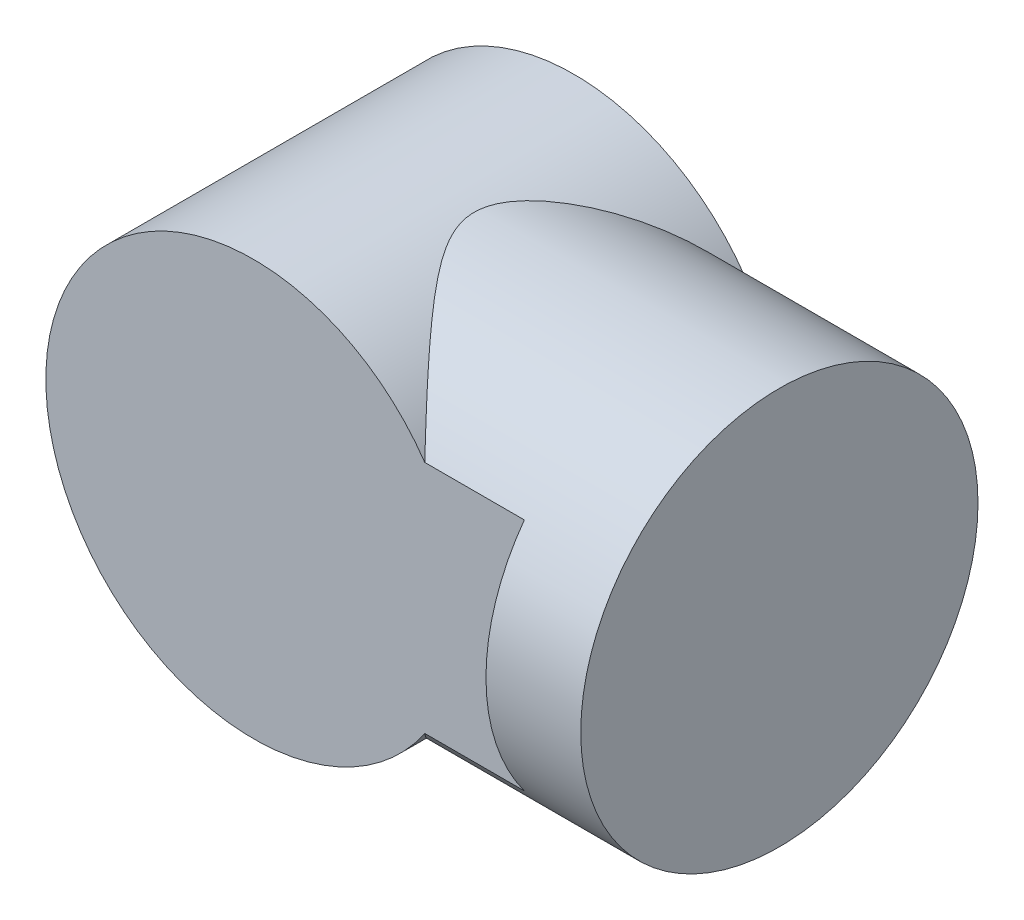
ISO-10303-21;
HEADER;
FILE_DESCRIPTION(('STEP AP214'),'2;1');
FILE_NAME('part.step','',(''),(''),'','','');
FILE_SCHEMA(('AUTOMOTIVE_DESIGN { 1 0 10303 214 1 1 1 1 }'));
ENDSEC;
DATA;
#1=APPLICATION_CONTEXT('core data for automotive mechanical design processes');
#2=APPLICATION_PROTOCOL_DEFINITION('international standard','automotive_design',2000,#1);
#3=PRODUCT_CONTEXT('',#1,'mechanical');
#4=PRODUCT('Part','Part','',(#3));
#5=PRODUCT_RELATED_PRODUCT_CATEGORY('part','',(#4));
#6=PRODUCT_DEFINITION_FORMATION('','',#4);
#7=PRODUCT_DEFINITION_CONTEXT('part definition',#1,'design');
#8=PRODUCT_DEFINITION('design','',#6,#7);
#9=PRODUCT_DEFINITION_SHAPE('','',#8);
#10=(LENGTH_UNIT() NAMED_UNIT(*) SI_UNIT(.MILLI.,.METRE.));
#11=(NAMED_UNIT(*) PLANE_ANGLE_UNIT() SI_UNIT($,.RADIAN.));
#12=(NAMED_UNIT(*) SI_UNIT($,.STERADIAN.) SOLID_ANGLE_UNIT());
#13=UNCERTAINTY_MEASURE_WITH_UNIT(LENGTH_MEASURE(1.E-05),#10,'distance_accuracy_value','');
#14=(GEOMETRIC_REPRESENTATION_CONTEXT(3) GLOBAL_UNCERTAINTY_ASSIGNED_CONTEXT((#13)) GLOBAL_UNIT_ASSIGNED_CONTEXT((#10,
#11,#12)) REPRESENTATION_CONTEXT('',''));
#15=CARTESIAN_POINT('',(0.,0.,0.));
#16=DIRECTION('',(0.,0.,1.));
#17=DIRECTION('',(1.,0.,0.));
#18=AXIS2_PLACEMENT_3D('',#15,#16,#17);
#19=CARTESIAN_POINT('',(-46.001,0.,0.));
#20=DIRECTION('',(1.,0.,0.));
#21=DIRECTION('',(0.,0.,-1.));
#22=AXIS2_PLACEMENT_3D('',#19,#20,#21);
#23=CYLINDRICAL_SURFACE('',#22,44.);
#24=CARTESIAN_POINT('',(81.,0.,0.));
#25=DIRECTION('',(1.,0.,0.));
#26=DIRECTION('',(0.,0.,-1.));
#27=AXIS2_PLACEMENT_3D('',#24,#25,#26);
#28=CIRCLE('',#27,44.);
#29=CARTESIAN_POINT('',(81.,0.,-44.));
#30=VERTEX_POINT('',#29);
#31=EDGE_CURVE('E99',#30,#30,#28,.T.);
#32=ORIENTED_EDGE('',*,*,#31,.F.);
#33=EDGE_LOOP('',(#32));
#34=FACE_BOUND('',#33,.T.);
#35=CARTESIAN_POINT('',(60.,0.,0.));
#36=DIRECTION('',(1.,0.,0.));
#37=DIRECTION('',(0.,0.,-1.));
#38=AXIS2_PLACEMENT_3D('',#35,#36,#37);
#39=CIRCLE('',#38,44.);
#40=CARTESIAN_POINT('',(60.,25.9951918631119,-35.5));
#41=VERTEX_POINT('',#40);
#42=CARTESIAN_POINT('',(60.,-25.9951918631119,-35.5));
#43=VERTEX_POINT('',#42);
#44=EDGE_CURVE('E11',#41,#43,#39,.F.);
#45=ORIENTED_EDGE('',*,*,#44,.F.);
#46=DIRECTION('',(1.,0.,0.));
#47=VECTOR('',#46,1.);
#48=CARTESIAN_POINT('',(-46.001,25.9951918631119,-35.5));
#49=LINE('',#48,#47);
#50=CARTESIAN_POINT('',(37.9506258182919,25.9951918631119,-35.5));
#51=VERTEX_POINT('',#50);
#52=EDGE_CURVE('E76',#41,#51,#49,.F.);
#53=ORIENTED_EDGE('',*,*,#52,.T.);
#54=CARTESIAN_POINT('',(46.,0.,-44.));
#55=CARTESIAN_POINT('',(45.9999991057955,0.498474220676919,-43.9999990933562));
#56=CARTESIAN_POINT('',(45.9918911782464,0.996963692521347,-43.9915228687049));
#57=CARTESIAN_POINT('',(45.9595141891246,1.99286088749782,-43.9576724035265));
#58=CARTESIAN_POINT('',(45.9352430356015,2.49026846224209,-43.9322959756644));
#59=CARTESIAN_POINT('',(45.838310778703,3.97977942802874,-43.8309384583672));
#60=CARTESIAN_POINT('',(45.741530996917,4.96882241231484,-43.7297292507759));
#61=CARTESIAN_POINT('',(45.4854837981313,6.9320927267576,-43.4618312832369));
#62=CARTESIAN_POINT('',(45.3260623756231,7.90627734827558,-43.2949811427232));
#63=CARTESIAN_POINT('',(44.9480946099699,9.83002949923253,-42.8991220167134));
#64=CARTESIAN_POINT('',(44.7295571347305,10.7796006974994,-42.6701223541519));
#65=CARTESIAN_POINT('',(44.2393242800979,12.6412913734987,-42.1559459302167));
#66=CARTESIAN_POINT('',(43.9680278102338,13.5536333156418,-41.8711906316068));
#67=CARTESIAN_POINT('',(43.3758705826448,15.3434844219592,-41.2489428287368));
#68=CARTESIAN_POINT('',(43.055009104289,16.2209930794556,-40.911449557713));
#69=CARTESIAN_POINT('',(42.3686965740621,17.9373222800729,-40.1885473092639));
#70=CARTESIAN_POINT('',(42.003266305577,18.776160606432,-39.8031606639729));
#71=CARTESIAN_POINT('',(41.2323653189115,20.4135016545342,-38.9887829085305));
#72=CARTESIAN_POINT('',(40.8268853718402,21.211995014965,-38.5597817473504));
#73=CARTESIAN_POINT('',(40.1057489538878,22.5370289440701,-37.7952655368586));
#74=CARTESIAN_POINT('',(39.7989794234237,23.0741759955678,-37.4696105805746));
#75=CARTESIAN_POINT('',(39.1695108539914,24.1272810085256,-36.8003191130999));
#76=CARTESIAN_POINT('',(38.846815163032,24.6432433820162,-36.4566863803062));
#77=CARTESIAN_POINT('',(37.8566653790016,26.1597136861254,-35.4003883118248));
#78=CARTESIAN_POINT('',(37.1672734069329,27.1285775238644,-34.6624552465624));
#79=CARTESIAN_POINT('',(35.7393897631714,28.9839743626513,-33.1267882618577));
#80=CARTESIAN_POINT('',(35.0007706053117,29.8702781180943,-32.32889833019));
#81=CARTESIAN_POINT('',(33.4858126070623,31.5592581006085,-30.6823076572974));
#82=CARTESIAN_POINT('',(32.7094764102405,32.3619401763162,-29.8336104761609));
#83=CARTESIAN_POINT('',(31.3954179461172,33.6282094995737,-28.3853985995029));
#84=CARTESIAN_POINT('',(30.8656572430636,34.1147651208718,-27.7985295595618));
#85=CARTESIAN_POINT('',(29.7961359088939,35.0527623149084,-26.6060028658219));
#86=CARTESIAN_POINT('',(29.2563745852962,35.5042014447091,-26.0003439089636));
#87=CARTESIAN_POINT('',(28.1692123228364,36.372790482232,-24.770691454131));
#88=CARTESIAN_POINT('',(27.621806628977,36.7899178242605,-24.1466862508457));
#89=CARTESIAN_POINT('',(26.5225407688364,37.5901174330788,-22.8810752855392));
#90=CARTESIAN_POINT('',(25.9706807668905,37.973190950028,-22.2394701707658));
#91=CARTESIAN_POINT('',(24.8666343252012,38.7051462499675,-20.9396058468446));
#92=CARTESIAN_POINT('',(24.3144501344452,39.0540865153954,-20.2813776437843));
#93=CARTESIAN_POINT('',(23.2125168932612,39.7189253930894,-18.9463242375302));
#94=CARTESIAN_POINT('',(22.6627680672462,40.0348210186229,-18.2694973602683));
#95=CARTESIAN_POINT('',(21.5711126657023,40.6334118602675,-16.896341241431));
#96=CARTESIAN_POINT('',(21.0291989286695,40.9161393290315,-16.2000317747518));
#97=CARTESIAN_POINT('',(19.9592352316696,41.4485877412,-14.7846698457253));
#98=CARTESIAN_POINT('',(19.4311818346367,41.6983169306329,-14.065623121125));
#99=CARTESIAN_POINT('',(18.560807272575,42.0909438225364,-12.8308171090757));
#100=CARTESIAN_POINT('',(18.2123022062613,42.2427395969765,-12.3222432999878));
#101=CARTESIAN_POINT('',(17.5305962923617,42.5301641335361,-11.2903548863018));
#102=CARTESIAN_POINT('',(17.1973960949178,42.6657922092508,-10.7670396570172));
#103=CARTESIAN_POINT('',(16.5524033255146,42.9201356009367,-9.70364574649877));
#104=CARTESIAN_POINT('',(16.2406004402049,43.0388590948796,-9.16357532603222));
#105=CARTESIAN_POINT('',(15.6464584524737,43.2583915871761,-8.06385990843248));
#106=CARTESIAN_POINT('',(15.3641106524148,43.3592058800591,-7.50422075519098));
#107=CARTESIAN_POINT('',(14.9201155060141,43.5135322660971,-6.53709527115962));
#108=CARTESIAN_POINT('',(14.7479228987183,43.5720924614871,-6.13527367838245));
#109=CARTESIAN_POINT('',(14.4279998713199,43.6790710301181,-5.32048772704189));
#110=CARTESIAN_POINT('',(14.2802736228141,43.7274876742215,-4.90752148220829));
#111=CARTESIAN_POINT('',(14.0151714288083,43.8131759575897,-4.07202265243101));
#112=CARTESIAN_POINT('',(13.8977092466148,43.8504793124488,-3.64952106536567));
#113=CARTESIAN_POINT('',(13.6982758170546,43.913189755525,-2.79550740140365));
#114=CARTESIAN_POINT('',(13.6162816809944,43.9386045167064,-2.364001324458));
#115=CARTESIAN_POINT('',(13.491580013188,43.9770586978446,-1.48777797585316));
#116=CARTESIAN_POINT('',(13.4495071155337,43.9898983082717,-1.04295963256592));
#117=CARTESIAN_POINT('',(13.4098662250679,44.0019994081826,-0.151166100706768));
#118=CARTESIAN_POINT('',(13.4122935915901,44.0012623134998,0.295808858104515));
#119=CARTESIAN_POINT('',(13.461485966472,43.9862366405351,1.18744029467898));
#120=CARTESIAN_POINT('',(13.5082911013329,43.9719357978708,1.63209430792691));
#121=CARTESIAN_POINT('',(13.6430272642661,43.9303162265192,2.51448128415329));
#122=CARTESIAN_POINT('',(13.7309691743375,43.9029940532353,2.95221238410433));
#123=CARTESIAN_POINT('',(13.9667249799138,43.828632726692,3.91592711257346));
#124=CARTESIAN_POINT('',(14.1235889328632,43.7785291207368,4.43943966414496));
#125=CARTESIAN_POINT('',(14.4803951449371,43.661805365252,5.46954138008817));
#126=CARTESIAN_POINT('',(14.6803551464378,43.595178411455,5.97612347478023));
#127=CARTESIAN_POINT('',(15.1143655112026,43.4466197183525,6.97476004807717));
#128=CARTESIAN_POINT('',(15.3485680510309,43.364619172696,7.46673722298604));
#129=CARTESIAN_POINT('',(15.8422306474448,43.186718636304,8.43502127982416));
#130=CARTESIAN_POINT('',(16.1016878580258,43.090820211157,8.91132991939983));
#131=CARTESIAN_POINT('',(16.7486354597575,42.8444439107725,10.0404115905965));
#132=CARTESIAN_POINT('',(17.1453958655871,42.6875983994208,10.6864600357511));
#133=CARTESIAN_POINT('',(17.9641425622474,42.3495717780898,11.9559711081228));
#134=CARTESIAN_POINT('',(18.3861403756146,42.1683795044093,12.5794232067505));
#135=CARTESIAN_POINT('',(19.2476023449202,41.7822095919305,13.8080471354936));
#136=CARTESIAN_POINT('',(19.6870927014003,41.5771953176373,14.4131889561763));
#137=CARTESIAN_POINT('',(20.5769763572125,41.1440519096593,15.6067253877097));
#138=CARTESIAN_POINT('',(21.027367811381,40.9159266672919,16.1951227966066));
#139=CARTESIAN_POINT('',(21.9360153927307,40.4360721134658,17.3585997471202));
#140=CARTESIAN_POINT('',(22.39428836055,40.1842852420203,17.9336423342479));
#141=CARTESIAN_POINT('',(23.3143665329651,39.6575513341238,19.0701565539816));
#142=CARTESIAN_POINT('',(23.7761718567954,39.3826035127111,19.6316277258001));
#143=CARTESIAN_POINT('',(24.7003476669434,38.8096406999433,20.7412956920965));
#144=CARTESIAN_POINT('',(25.1627173789927,38.5116448141835,21.2895029969937));
#145=CARTESIAN_POINT('',(26.0862622452111,37.8921645638872,22.373500936786));
#146=CARTESIAN_POINT('',(26.5474374067173,37.5706803439767,22.9092916481077));
#147=CARTESIAN_POINT('',(27.4887611981601,36.8879657400962,23.9939163423041));
#148=CARTESIAN_POINT('',(27.9687614291329,36.5255694504365,24.5421471366226));
#149=CARTESIAN_POINT('',(28.9234797376278,35.7743122578205,25.6248450491952));
#150=CARTESIAN_POINT('',(29.398197759664,35.3854510771736,26.1593120229472));
#151=CARTESIAN_POINT('',(30.8120624337818,34.1782486906925,27.7418264728967));
#152=CARTESIAN_POINT('',(31.740766873158,33.3193983725639,28.7688124926849));
#153=CARTESIAN_POINT('',(33.5531822103498,31.493410711454,30.7568105109239));
#154=CARTESIAN_POINT('',(34.4370144479968,30.5265908212431,31.7180031805648));
#155=CARTESIAN_POINT('',(36.147862509031,28.4799778495529,33.5677139033706));
#156=CARTESIAN_POINT('',(36.9749058910807,27.4002402162326,34.4562672476309));
#157=CARTESIAN_POINT('',(38.3160177525953,25.4718060368992,35.8909555942456));
#158=CARTESIAN_POINT('',(38.8488790648495,24.652477508073,36.4591530981775));
#159=CARTESIAN_POINT('',(39.8733084474515,22.9586261688946,37.5488384075521));
#160=CARTESIAN_POINT('',(40.3648798463517,22.0841078175976,38.0703299783802));
#161=CARTESIAN_POINT('',(41.2998653307251,20.2817911537227,39.0602774670052));
#162=CARTESIAN_POINT('',(41.743312933418,19.354030620713,39.5287703070863));
#163=CARTESIAN_POINT('',(42.575501221285,17.4472951666461,40.4065937094412));
#164=CARTESIAN_POINT('',(42.9642496668141,16.4683275376019,40.8159326643008));
#165=CARTESIAN_POINT('',(43.6253865039708,14.6164141771331,41.5112524922736));
#166=CARTESIAN_POINT('',(43.9064790699009,13.7500586885177,41.8065258490397));
#167=CARTESIAN_POINT('',(44.4200883321119,11.9874138182303,42.3456132148078));
#168=CARTESIAN_POINT('',(44.6526096692976,11.091127305921,42.5894321402231));
#169=CARTESIAN_POINT('',(45.065103808975,9.27383988021257,43.0217126469449));
#170=CARTESIAN_POINT('',(45.2451008085679,8.35285056119437,43.21019971897));
#171=CARTESIAN_POINT('',(45.5493925258673,6.49167638118627,43.5287189960837));
#172=CARTESIAN_POINT('',(45.6736867298744,5.55149134325428,43.6587506620882));
#173=CARTESIAN_POINT('',(45.8645055237122,3.654994030644,43.8583370470438));
#174=CARTESIAN_POINT('',(45.9307951285613,2.69863201014301,43.9276457700284));
#175=CARTESIAN_POINT('',(46.0033728245079,0.781132748701573,44.0035275260395));
#176=CARTESIAN_POINT('',(46.009660810767,-0.180004500579494,44.0101004494504));
#177=CARTESIAN_POINT('',(45.9621039126271,-2.09913869656331,43.9603804309944));
#178=CARTESIAN_POINT('',(45.9082593068205,-3.05713565779429,43.9040877803818));
#179=CARTESIAN_POINT('',(45.7415591120266,-4.96226480570737,43.7297482431973));
#180=CARTESIAN_POINT('',(45.6287049177894,-5.90939724864242,43.6117028162134));
#181=CARTESIAN_POINT('',(45.3552176039902,-7.72619642674927,43.3254823597861));
#182=CARTESIAN_POINT('',(45.1980635113788,-8.59697002503187,43.160956073455));
#183=CARTESIAN_POINT('',(44.8365971637417,-10.3175713947623,42.7822817226858));
#184=CARTESIAN_POINT('',(44.6322883805435,-11.1674007031659,42.5681373114445));
#185=CARTESIAN_POINT('',(44.1795810410279,-12.8420109922819,42.0932361131095));
#186=CARTESIAN_POINT('',(43.9311740031911,-13.6667871186566,41.8324703591563));
#187=CARTESIAN_POINT('',(43.3936526663988,-15.2879127960878,41.2676220166935));
#188=CARTESIAN_POINT('',(43.1045303406061,-16.0842567029598,40.9635308866406));
#189=CARTESIAN_POINT('',(42.5880960585304,-17.3947860561533,40.4196817048791));
#190=CARTESIAN_POINT('',(42.3707667095088,-17.9174285419974,40.1906407193435));
#191=CARTESIAN_POINT('',(41.9202003521679,-18.9476344826054,39.715348594319));
#192=CARTESIAN_POINT('',(41.6869667029355,-19.4552010891777,39.4691010886843));
#193=CARTESIAN_POINT('',(40.9648257746883,-20.9550550179083,38.7058670934224));
#194=CARTESIAN_POINT('',(40.4535355918807,-21.9243528347075,38.1644491705458));
#195=CARTESIAN_POINT('',(39.3792455378769,-23.8001161240237,37.0238008632852));
#196=CARTESIAN_POINT('',(38.8161682789381,-24.7064838908614,36.4244838881099));
#197=CARTESIAN_POINT('',(37.6468010169544,-26.4541877864299,35.1756953961261));
#198=CARTESIAN_POINT('',(37.0405099556913,-27.2955223215767,34.526222651072));
#199=CARTESIAN_POINT('',(35.5693150039378,-29.2017826929425,32.9437324095996));
#200=CARTESIAN_POINT('',(34.689193326227,-30.2396591034089,31.9920943539333));
#201=CARTESIAN_POINT('',(33.3315768592024,-31.7088522325635,30.512818241853));
#202=CARTESIAN_POINT('',(32.8726322025673,-32.184130372199,30.010905333949));
#203=CARTESIAN_POINT('',(31.9440747628539,-33.105949258592,28.9908361812203));
#204=CARTESIAN_POINT('',(31.4744630136198,-33.5524927743381,28.4726815086976));
#205=CARTESIAN_POINT('',(30.5257130198459,-34.4179285348321,27.4202682107408));
#206=CARTESIAN_POINT('',(30.0465612114215,-34.8367771131238,26.8859860018416));
#207=CARTESIAN_POINT('',(29.0813255530749,-35.6465046405804,25.8027888295472));
#208=CARTESIAN_POINT('',(28.5952421616502,-36.0373854295093,25.2538748319198));
#209=CARTESIAN_POINT('',(27.6181960896843,-36.7915192721494,24.1419816741413));
#210=CARTESIAN_POINT('',(27.1272349506273,-37.1547807587243,23.5790068774139));
#211=CARTESIAN_POINT('',(26.1424311597805,-37.8541698570776,22.439004026258));
#212=CARTESIAN_POINT('',(25.6485886253559,-38.1902985658699,21.8619765412274));
#213=CARTESIAN_POINT('',(24.4319398752074,-38.9849205396582,20.423731486213));
#214=CARTESIAN_POINT('',(23.7087391859495,-39.4282189421888,19.5543581765803));
#215=CARTESIAN_POINT('',(22.6298049652196,-40.0507774217041,18.2256474576928));
#216=CARTESIAN_POINT('',(22.2710678062853,-40.2512674432315,17.7785447511211));
#217=CARTESIAN_POINT('',(21.5570750536429,-40.6381255170069,16.8755474534217));
#218=CARTESIAN_POINT('',(21.2018192591494,-40.824494387907,16.4196533738857));
#219=CARTESIAN_POINT('',(20.4975083353033,-41.1826155430248,15.4995245985939));
#220=CARTESIAN_POINT('',(20.1484393776479,-41.3544049099841,15.0353149370913));
#221=CARTESIAN_POINT('',(19.4577888974822,-41.6838193112784,14.0963399796515));
#222=CARTESIAN_POINT('',(19.1162078743755,-41.8414434030277,13.6215739838931));
#223=CARTESIAN_POINT('',(18.4437364344185,-42.1421894287749,12.660538116617));
#224=CARTESIAN_POINT('',(18.1128385102102,-42.2853217046943,12.1742767587104));
#225=CARTESIAN_POINT('',(17.4654014152404,-42.5568190274671,11.188324895258));
#226=CARTESIAN_POINT('',(17.1488593738749,-42.6851870345415,10.6886371065699));
#227=CARTESIAN_POINT('',(16.5921337553959,-42.9042344543289,9.7676646448905));
#228=CARTESIAN_POINT('',(16.3486616691771,-42.9974918616006,9.34898806171308));
#229=CARTESIAN_POINT('',(15.8784692639004,-43.1733386550714,8.5000446320923));
#230=CARTESIAN_POINT('',(15.6517496135609,-43.2559276155091,8.06977732390857));
#231=CARTESIAN_POINT('',(15.2199989190238,-43.4097238419866,7.19668452855354));
#232=CARTESIAN_POINT('',(15.0149575113781,-43.4809365549239,6.75386517155504));
#233=CARTESIAN_POINT('',(14.6325324288437,-43.61112014606,5.85461053605349));
#234=CARTESIAN_POINT('',(14.4551433269108,-43.6700934271257,5.39817795028571));
#235=CARTESIAN_POINT('',(14.1655438574076,-43.764780891726,4.55925847087136));
#236=CARTESIAN_POINT('',(14.047351371332,-43.8027845346499,4.17910770526228));
#237=CARTESIAN_POINT('',(13.8381976171078,-43.8693099860955,3.41061181633978));
#238=CARTESIAN_POINT('',(13.7472268302004,-43.8978351094086,3.0222696083403));
#239=CARTESIAN_POINT('',(13.5966940930613,-43.9446943868339,2.23986047315991));
#240=CARTESIAN_POINT('',(13.5370543257074,-43.963053795808,1.84581025114079));
#241=CARTESIAN_POINT('',(13.4519598726963,-43.9891668292305,1.05365299850918));
#242=CARTESIAN_POINT('',(13.4265028361947,-43.9969211830197,0.655546248773277));
#243=CARTESIAN_POINT('',(13.4112022399971,-44.0015878177201,-0.143279797169979));
#244=CARTESIAN_POINT('',(13.4215247150388,-43.9984495513615,-0.544002637249472));
#245=CARTESIAN_POINT('',(13.4775398486,-43.9813227011192,-1.34270730500744));
#246=CARTESIAN_POINT('',(13.5232341223313,-43.9673336217456,-1.74068900667773));
#247=CARTESIAN_POINT('',(13.6476002334707,-43.9288879134042,-2.53180919863134));
#248=CARTESIAN_POINT('',(13.7263471129825,-43.9044074623178,-2.92493455907374));
#249=CARTESIAN_POINT('',(13.9130200023873,-43.8456089793675,-3.70338457338835));
#250=CARTESIAN_POINT('',(14.0209504706593,-43.8112894443378,-4.08870802568665));
#251=CARTESIAN_POINT('',(14.3319605640458,-43.7108090981981,-5.07274095886768));
#252=CARTESIAN_POINT('',(14.5538175730228,-43.6377523714506,-5.66480899060288));
#253=CARTESIAN_POINT('',(15.043981133913,-43.4712041806783,-6.82637547582605));
#254=CARTESIAN_POINT('',(15.3123244116039,-43.3776965442706,-7.3958556436072));
#255=CARTESIAN_POINT('',(15.8836948518863,-43.1717597433559,-8.51614046600068));
#256=CARTESIAN_POINT('',(16.1868482949096,-43.0592609439585,-9.06686708654001));
#257=CARTESIAN_POINT('',(16.8174687786501,-42.8169002099515,-10.1499210302313));
#258=CARTESIAN_POINT('',(17.1449300647992,-42.6870423790757,-10.6822526647028));
#259=CARTESIAN_POINT('',(17.8713246074478,-42.388602095986,-11.81535398465));
#260=CARTESIAN_POINT('',(18.2732976510977,-42.2171491599787,-12.4134072300776));
#261=CARTESIAN_POINT('',(19.0933580113018,-41.8526613828774,-13.5917260179734));
#262=CARTESIAN_POINT('',(19.5114490494762,-41.659621537604,-14.1719873961232));
#263=CARTESIAN_POINT('',(20.3587085810287,-41.252202292185,-15.3174932601553));
#264=CARTESIAN_POINT('',(20.7878861329332,-41.0378050048307,-15.88272464768));
#265=CARTESIAN_POINT('',(21.6530253227887,-40.587981575194,-16.999352008275));
#266=CARTESIAN_POINT('',(22.0889864078754,-40.3525571393075,-17.5507490993833));
#267=CARTESIAN_POINT('',(22.9652770477117,-39.860367909846,-18.6416072136349));
#268=CARTESIAN_POINT('',(23.4056112309807,-39.6035777583849,-19.1810530630093));
#269=CARTESIAN_POINT('',(24.2877629609469,-39.0687938735889,-20.2480978510869));
#270=CARTESIAN_POINT('',(24.7295805239924,-38.7907999058292,-20.7756966587283));
#271=CARTESIAN_POINT('',(25.6125760980256,-38.2135328726981,-21.8192881798057));
#272=CARTESIAN_POINT('',(26.0537542821465,-37.9142675141241,-22.335285008439));
#273=CARTESIAN_POINT('',(26.9339452696553,-37.2941342519974,-23.3560304003885));
#274=CARTESIAN_POINT('',(27.3729580481559,-36.9732661007795,-23.8607788346591));
#275=CARTESIAN_POINT('',(28.3270296288398,-36.2491442801775,-24.9499840140371));
#276=CARTESIAN_POINT('',(28.8413590111032,-35.8415363765704,-25.5321936924144));
#277=CARTESIAN_POINT('',(29.8625744108552,-34.995235153454,-26.6803699221393));
#278=CARTESIAN_POINT('',(30.3694602198751,-34.5565409653218,-27.2463360189823));
#279=CARTESIAN_POINT('',(31.3737827150409,-33.647358864171,-28.3614696211607));
#280=CARTESIAN_POINT('',(31.871215388667,-33.1768578200972,-28.9106300508965));
#281=CARTESIAN_POINT('',(32.8541963099275,-32.2037285985475,-29.9908038837158));
#282=CARTESIAN_POINT('',(33.3397449020501,-31.7011013538542,-30.5218178129957));
#283=CARTESIAN_POINT('',(34.2954344971651,-30.6646144854799,-31.5629427383405));
#284=CARTESIAN_POINT('',(34.7656142302563,-30.13084463522,-32.0731072457141));
#285=CARTESIAN_POINT('',(35.6895705851341,-29.0305188772875,-33.0723689392413));
#286=CARTESIAN_POINT('',(36.1433465426374,-28.4639616442758,-33.5614652723764));
#287=CARTESIAN_POINT('',(37.4758926872101,-26.7152161303337,-34.9937930318769));
#288=CARTESIAN_POINT('',(38.3269073412684,-25.4828539303549,-35.9031776826905));
#289=CARTESIAN_POINT('',(39.6246853841574,-23.3831776487505,-37.2846888480144));
#290=CARTESIAN_POINT('',(40.1015627940113,-22.5565427382403,-37.7910144594656));
#291=CARTESIAN_POINT('',(41.0128371077525,-20.8537570612932,-38.7566561217023));
#292=CARTESIAN_POINT('',(41.4472393415877,-19.9776125293414,-39.2159780710254));
#293=CARTESIAN_POINT('',(42.2674263976321,-18.1780520666711,-40.0818482538723));
#294=CARTESIAN_POINT('',(42.6532334366098,-17.2546580110294,-40.4884206060491));
#295=CARTESIAN_POINT('',(43.1908690326879,-15.8368086731965,-41.0542885989098));
#296=CARTESIAN_POINT('',(43.3632318563311,-15.3587429870956,-41.2355761345437));
#297=CARTESIAN_POINT('',(43.6935961939978,-14.3920333023776,-41.5828476018771));
#298=CARTESIAN_POINT('',(43.8515938657254,-13.9033865166186,-41.7488274393441));
#299=CARTESIAN_POINT('',(44.2625875683076,-12.554760394533,-42.1803702797221));
#300=CARTESIAN_POINT('',(44.5004259016307,-11.6848890942906,-42.4298526710992));
#301=CARTESIAN_POINT('',(44.926779645041,-9.92008506115648,-42.8768005974716));
#302=CARTESIAN_POINT('',(45.1153034813488,-9.02515663866774,-43.0742750189525));
#303=CARTESIAN_POINT('',(45.3585244536124,-7.66908868708299,-43.3289321178209));
#304=CARTESIAN_POINT('',(45.432951812459,-7.21522600798699,-43.4068375227077));
#305=CARTESIAN_POINT('',(45.5684079407432,-6.30337314685518,-43.5485963324032));
#306=CARTESIAN_POINT('',(45.6294389380334,-5.845383664327,-43.6124520737144));
#307=CARTESIAN_POINT('',(45.737798727876,-4.92624022998917,-43.7258105532654));
#308=CARTESIAN_POINT('',(45.7851337744511,-4.46508782126906,-43.7753198425835));
#309=CARTESIAN_POINT('',(45.8659129671895,-3.54026233746941,-43.8598007931431));
#310=CARTESIAN_POINT('',(45.8993579045749,-3.07658940749098,-43.8947732824443));
#311=CARTESIAN_POINT('',(45.9504814379907,-2.17773495122665,-43.9482286447088));
#312=CARTESIAN_POINT('',(45.9690427076923,-1.74265818411762,-43.967634712003));
#313=CARTESIAN_POINT('',(45.9938030571856,-0.871724885093671,-43.9935214944411));
#314=CARTESIAN_POINT('',(46.0000007818968,-0.435868272944872,-44.0000007927737));
#315=CARTESIAN_POINT('',(46.,0.,-44.));
#316=B_SPLINE_CURVE_WITH_KNOTS('',3,(#54,#55,#56,#57,#58,#59,#60,#61,#62,#63,#64,#65,#66,#67,
#68,#69,#70,#71,#72,#73,#74,#75,#76,#77,#78,#79,#80,#81,#82,#83,#84,#85,#86,#87,#88,#89,#90,#91,
#92,#93,#94,#95,#96,#97,#98,#99,#100,#101,#102,#103,#104,#105,#106,#107,#108,#109,#110,#111,
#112,#113,#114,#115,#116,#117,#118,#119,#120,#121,#122,#123,#124,#125,#126,#127,#128,#129,#130,
#131,#132,#133,#134,#135,#136,#137,#138,#139,#140,#141,#142,#143,#144,#145,#146,#147,#148,#149,
#150,#151,#152,#153,#154,#155,#156,#157,#158,#159,#160,#161,#162,#163,#164,#165,#166,#167,#168,
#169,#170,#171,#172,#173,#174,#175,#176,#177,#178,#179,#180,#181,#182,#183,#184,#185,#186,#187,
#188,#189,#190,#191,#192,#193,#194,#195,#196,#197,#198,#199,#200,#201,#202,#203,#204,#205,#206,
#207,#208,#209,#210,#211,#212,#213,#214,#215,#216,#217,#218,#219,#220,#221,#222,#223,#224,#225,
#226,#227,#228,#229,#230,#231,#232,#233,#234,#235,#236,#237,#238,#239,#240,#241,#242,#243,#244,
#245,#246,#247,#248,#249,#250,#251,#252,#253,#254,#255,#256,#257,#258,#259,#260,#261,#262,#263,
#264,#265,#266,#267,#268,#269,#270,#271,#272,#273,#274,#275,#276,#277,#278,#279,#280,#281,#282,
#283,#284,#285,#286,#287,#288,#289,#290,#291,#292,#293,#294,#295,#296,#297,#298,#299,#300,#301,
#302,#303,#304,#305,#306,#307,#308,#309,#310,#311,#312,#313,#314,#315),.UNSPECIFIED.,.T.,.F.,(4,
2,2,2,2,2,2,2,2,2,2,2,2,2,2,2,2,2,2,2,2,2,2,2,2,2,2,2,2,2,2,2,2,2,2,2,2,2,2,2,2,2,2,2,2,2,2,2,2,
2,2,2,2,2,2,2,2,2,2,2,2,2,2,2,2,2,2,2,2,2,2,2,2,2,2,2,2,2,2,2,2,2,2,2,2,2,2,2,2,2,2,2,2,2,2,2,2,
2,2,2,2,2,2,2,2,2,2,2,2,2,2,2,2,2,2,2,2,2,2,2,2,2,2,2,2,2,2,2,2,2,4),(0.,1.49529325977098,
2.9907800878017,5.98279557110146,8.98221346749885,11.9811816752308,14.9582994110594,
17.9354604355918,20.9112384162875,23.8877037305575,25.9841634590321,28.0801843300236,
32.2730960174372,36.4773232668592,40.6812562680798,43.4654165361608,46.2497703161284,
49.0359408688316,51.8220090953717,54.6032169616297,57.3846759899473,60.1634075119259,
62.9414433307122,64.8458060075203,66.7502495058749,68.6537685335644,70.5567238805911,
71.8791680827885,73.201837534586,74.5206953165365,75.8387007219465,77.1773239848568,
78.5158076515505,79.8555027342246,81.1955524098936,82.83916819863,84.4834619508003,
86.1352986568466,87.7869494288117,90.1080402113034,92.4301989368032,94.7559773572467,
97.0813648227406,99.4125632307534,101.743840678621,104.073205919796,106.402556819456,
108.843400701201,111.284270198174,116.166778047276,121.035290576075,125.901423552653,
129.290319164076,132.678941319746,136.065188015464,139.450953807413,142.32054039517,
145.189852672878,148.057841011041,150.925855797662,153.80543623733,156.685021708365,
159.564593838425,162.444097910025,165.141216800516,167.838137175304,170.535576818112,
173.233548995515,175.064769038957,176.895603508177,180.557768034587,184.225496882583,
187.893315576683,192.86707851441,195.355698997915,197.844079307298,200.336293820621,
202.828344241248,205.319630695268,207.810816372783,211.452699910168,213.27436086603,
215.095916132945,216.912690031016,218.729584731445,220.545173548419,222.360397704751,
223.839620488771,225.318902288071,226.79747367706,228.275754515144,229.474525823304,
230.672877459448,231.868238497097,233.063517322129,234.264350246986,235.465238009708,
236.668867123914,237.872680220622,239.778715709197,241.686263957621,243.600964895459,
245.515213989348,247.736471034517,249.958244073029,252.181893782324,254.405363201594,
256.631510252873,258.857681919512,261.083051097434,263.308445792445,265.939603324961,
268.570834407128,271.203158472687,273.835406143535,276.460408686974,279.08551741308,
284.330141167319,287.568625669589,290.80670327147,294.043295072741,295.661522449016,
297.280181392496,300.084144462884,302.887628115078,304.286704809426,305.685548656817,
307.083752734267,308.481877154922,309.78922554248,311.096717211352),.UNSPECIFIED.);
#317=CARTESIAN_POINT('',(37.9506258182919,25.9951918631119,35.5));
#318=VERTEX_POINT('',#317);
#319=EDGE_CURVE('E102',#51,#318,#316,.T.);
#320=ORIENTED_EDGE('',*,*,#319,.T.);
#321=DIRECTION('',(1.,0.,0.));
#322=VECTOR('',#321,1.);
#323=CARTESIAN_POINT('',(-46.001,25.9951918631119,35.5));
#324=LINE('',#323,#322);
#325=CARTESIAN_POINT('',(60.,25.9951918631119,35.5));
#326=VERTEX_POINT('',#325);
#327=EDGE_CURVE('E49',#318,#326,#324,.T.);
#328=ORIENTED_EDGE('',*,*,#327,.T.);
#329=CARTESIAN_POINT('',(60.,0.,0.));
#330=DIRECTION('',(-1.,0.,0.));
#331=DIRECTION('',(0.,0.,1.));
#332=AXIS2_PLACEMENT_3D('',#329,#330,#331);
#333=CIRCLE('',#332,44.);
#334=CARTESIAN_POINT('',(60.,-25.9951918631119,35.5));
#335=VERTEX_POINT('',#334);
#336=EDGE_CURVE('E42',#326,#335,#333,.F.);
#337=ORIENTED_EDGE('',*,*,#336,.T.);
#338=DIRECTION('',(1.,0.,0.));
#339=VECTOR('',#338,1.);
#340=CARTESIAN_POINT('',(-46.001,-25.9951918631119,35.5));
#341=LINE('',#340,#339);
#342=CARTESIAN_POINT('',(37.9506258182919,-25.9951918631119,35.5));
#343=VERTEX_POINT('',#342);
#344=EDGE_CURVE('E97',#335,#343,#341,.F.);
#345=ORIENTED_EDGE('',*,*,#344,.T.);
#346=CARTESIAN_POINT('',(37.9506258182919,-25.9951918631119,-35.5));
#347=VERTEX_POINT('',#346);
#348=EDGE_CURVE('E92',#343,#347,#316,.T.);
#349=ORIENTED_EDGE('',*,*,#348,.T.);
#350=DIRECTION('',(1.,0.,0.));
#351=VECTOR('',#350,1.);
#352=CARTESIAN_POINT('',(-46.001,-25.9951918631119,-35.5));
#353=LINE('',#352,#351);
#354=EDGE_CURVE('E85',#347,#43,#353,.T.);
#355=ORIENTED_EDGE('',*,*,#354,.T.);
#356=EDGE_LOOP('',(#45,#53,#320,#328,#337,#345,#349,#355));
#357=FACE_BOUND('',#356,.T.);
#358=ADVANCED_FACE('F34',(#34,#357),#23,.T.);
#359=CARTESIAN_POINT('',(0.,0.,35.5));
#360=DIRECTION('',(0.,0.,-1.));
#361=DIRECTION('',(-1.,0.,0.));
#362=AXIS2_PLACEMENT_3D('',#359,#360,#361);
#363=CYLINDRICAL_SURFACE('',#362,46.);
#364=CARTESIAN_POINT('',(0.,0.,35.5));
#365=DIRECTION('',(0.,0.,1.));
#366=DIRECTION('',(1.,0.,0.));
#367=AXIS2_PLACEMENT_3D('',#364,#365,#366);
#368=CIRCLE('',#367,46.);
#369=EDGE_CURVE('E108',#318,#343,#368,.T.);
#370=ORIENTED_EDGE('',*,*,#369,.F.);
#371=ORIENTED_EDGE('',*,*,#319,.F.);
#372=CARTESIAN_POINT('',(0.,0.,-35.5));
#373=DIRECTION('',(0.,0.,1.));
#374=DIRECTION('',(1.,0.,0.));
#375=AXIS2_PLACEMENT_3D('',#372,#373,#374);
#376=CIRCLE('',#375,46.);
#377=EDGE_CURVE('E57',#51,#347,#376,.T.);
#378=ORIENTED_EDGE('',*,*,#377,.T.);
#379=ORIENTED_EDGE('',*,*,#348,.F.);
#380=EDGE_LOOP('',(#370,#371,#378,#379));
#381=FACE_BOUND('',#380,.T.);
#382=ADVANCED_FACE('F36',(#381),#363,.T.);
#383=CARTESIAN_POINT('',(0.,0.,35.5));
#384=DIRECTION('',(0.,0.,1.));
#385=DIRECTION('',(1.,0.,0.));
#386=AXIS2_PLACEMENT_3D('',#383,#384,#385);
#387=PLANE('',#386);
#388=ORIENTED_EDGE('',*,*,#369,.T.);
#389=ORIENTED_EDGE('',*,*,#344,.F.);
#390=DIRECTION('',(0.,1.,0.));
#391=VECTOR('',#390,1.);
#392=CARTESIAN_POINT('',(60.,32.4187263265557,35.5));
#393=LINE('',#392,#391);
#394=EDGE_CURVE('E84',#335,#326,#393,.T.);
#395=ORIENTED_EDGE('',*,*,#394,.T.);
#396=ORIENTED_EDGE('',*,*,#327,.F.);
#397=EDGE_LOOP('',(#388,#389,#395,#396));
#398=FACE_BOUND('',#397,.T.);
#399=ADVANCED_FACE('F130',(#398),#387,.T.);
#400=CARTESIAN_POINT('',(0.,0.,-35.5));
#401=DIRECTION('',(0.,0.,1.));
#402=DIRECTION('',(1.,0.,0.));
#403=AXIS2_PLACEMENT_3D('',#400,#401,#402);
#404=PLANE('',#403);
#405=ORIENTED_EDGE('',*,*,#354,.F.);
#406=ORIENTED_EDGE('',*,*,#377,.F.);
#407=ORIENTED_EDGE('',*,*,#52,.F.);
#408=DIRECTION('',(0.,-1.,0.));
#409=VECTOR('',#408,1.);
#410=CARTESIAN_POINT('',(60.,32.4187263265557,-35.5));
#411=LINE('',#410,#409);
#412=EDGE_CURVE('E79',#41,#43,#411,.T.);
#413=ORIENTED_EDGE('',*,*,#412,.T.);
#414=EDGE_LOOP('',(#405,#406,#407,#413));
#415=FACE_BOUND('',#414,.T.);
#416=ADVANCED_FACE('F78',(#415),#404,.F.);
#417=CARTESIAN_POINT('',(81.,0.,0.));
#418=DIRECTION('',(1.,0.,0.));
#419=DIRECTION('',(0.,0.,-1.));
#420=AXIS2_PLACEMENT_3D('',#417,#418,#419);
#421=PLANE('',#420);
#422=ORIENTED_EDGE('',*,*,#31,.T.);
#423=EDGE_LOOP('',(#422));
#424=FACE_BOUND('',#423,.T.);
#425=ADVANCED_FACE('F114',(#424),#421,.T.);
#426=CARTESIAN_POINT('',(60.,0.,0.));
#427=DIRECTION('',(-1.,0.,0.));
#428=DIRECTION('',(0.,0.,1.));
#429=AXIS2_PLACEMENT_3D('',#426,#427,#428);
#430=PLANE('',#429);
#431=ORIENTED_EDGE('',*,*,#394,.F.);
#432=ORIENTED_EDGE('',*,*,#336,.F.);
#433=EDGE_LOOP('',(#431,#432));
#434=FACE_BOUND('',#433,.T.);
#435=ADVANCED_FACE('F117',(#434),#430,.T.);
#436=CARTESIAN_POINT('',(60.,0.,0.));
#437=DIRECTION('',(1.,0.,0.));
#438=DIRECTION('',(0.,0.,-1.));
#439=AXIS2_PLACEMENT_3D('',#436,#437,#438);
#440=PLANE('',#439);
#441=ORIENTED_EDGE('',*,*,#44,.T.);
#442=ORIENTED_EDGE('',*,*,#412,.F.);
#443=EDGE_LOOP('',(#441,#442));
#444=FACE_BOUND('',#443,.T.);
#445=ADVANCED_FACE('F88',(#444),#440,.F.);
#446=CLOSED_SHELL('',(#358,#382,#399,#416,#425,#435,#445));
#447=MANIFOLD_SOLID_BREP('B2',#446);
#448=ADVANCED_BREP_SHAPE_REPRESENTATION('',(#18,#447),#14);
#449=SHAPE_DEFINITION_REPRESENTATION(#9,#448);
ENDSEC;
END-ISO-10303-21;
